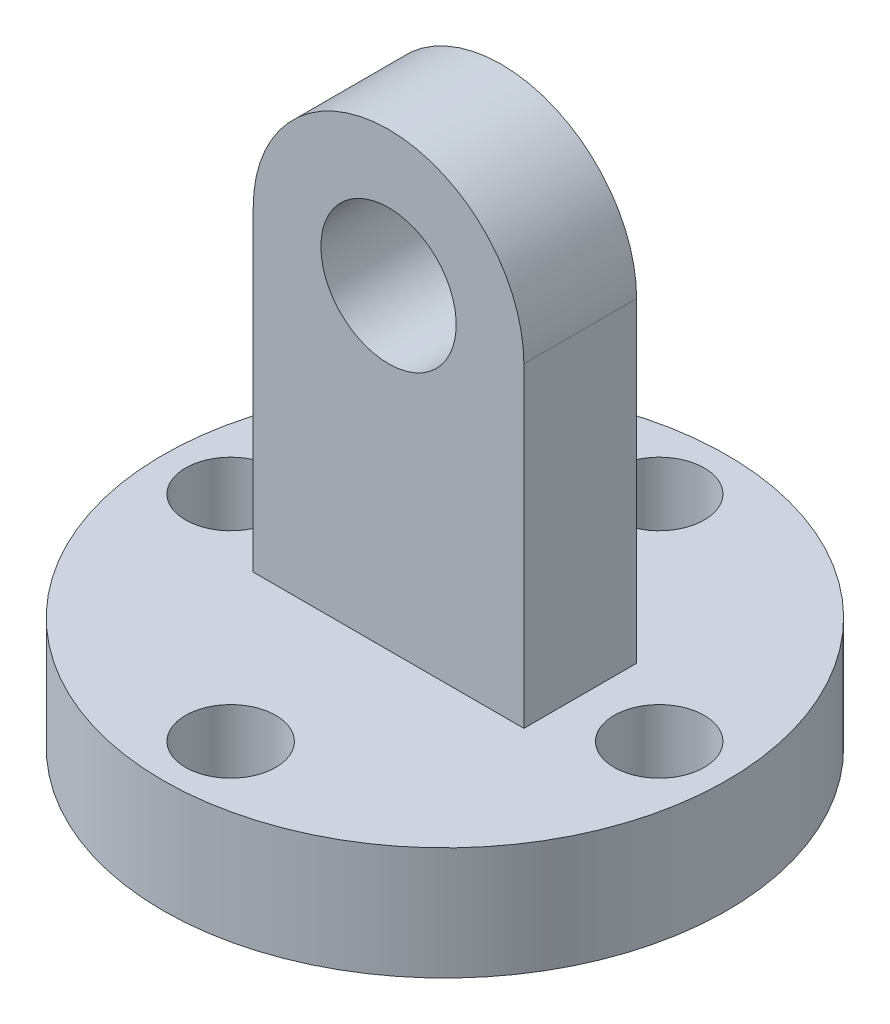
ISO-10303-21;
HEADER;
FILE_DESCRIPTION(('STEP AP214'),'2;1');
FILE_NAME('part.step','',(''),(''),'','','');
FILE_SCHEMA(('AUTOMOTIVE_DESIGN { 1 0 10303 214 1 1 1 1 }'));
ENDSEC;
DATA;
#1=APPLICATION_CONTEXT('core data for automotive mechanical design processes');
#2=APPLICATION_PROTOCOL_DEFINITION('international standard','automotive_design',2000,#1);
#3=PRODUCT_CONTEXT('',#1,'mechanical');
#4=PRODUCT('Part','Part','',(#3));
#5=PRODUCT_RELATED_PRODUCT_CATEGORY('part','',(#4));
#6=PRODUCT_DEFINITION_FORMATION('','',#4);
#7=PRODUCT_DEFINITION_CONTEXT('part definition',#1,'design');
#8=PRODUCT_DEFINITION('design','',#6,#7);
#9=PRODUCT_DEFINITION_SHAPE('','',#8);
#10=(LENGTH_UNIT() NAMED_UNIT(*) SI_UNIT(.MILLI.,.METRE.));
#11=(NAMED_UNIT(*) PLANE_ANGLE_UNIT() SI_UNIT($,.RADIAN.));
#12=(NAMED_UNIT(*) SI_UNIT($,.STERADIAN.) SOLID_ANGLE_UNIT());
#13=UNCERTAINTY_MEASURE_WITH_UNIT(LENGTH_MEASURE(1.E-05),#10,'distance_accuracy_value','');
#14=(GEOMETRIC_REPRESENTATION_CONTEXT(3) GLOBAL_UNCERTAINTY_ASSIGNED_CONTEXT((#13)) GLOBAL_UNIT_ASSIGNED_CONTEXT((#10,
#11,#12)) REPRESENTATION_CONTEXT('',''));
#15=CARTESIAN_POINT('',(0.,0.,0.));
#16=DIRECTION('',(0.,0.,1.));
#17=DIRECTION('',(1.,0.,0.));
#18=AXIS2_PLACEMENT_3D('',#15,#16,#17);
#19=CARTESIAN_POINT('',(5.99999999999999,25.,2.5));
#20=DIRECTION('',(0.,0.,-1.));
#21=DIRECTION('',(-1.,0.,0.));
#22=AXIS2_PLACEMENT_3D('',#19,#20,#21);
#23=PLANE('',#22);
#24=CARTESIAN_POINT('',(0.,19.,2.5));
#25=DIRECTION('',(0.,0.,-1.));
#26=DIRECTION('',(-1.,0.,0.));
#27=AXIS2_PLACEMENT_3D('',#24,#25,#26);
#28=CIRCLE('',#27,3.);
#29=CARTESIAN_POINT('',(-3.00000000000001,19.,2.5));
#30=VERTEX_POINT('',#29);
#31=EDGE_CURVE('E127',#30,#30,#28,.T.);
#32=ORIENTED_EDGE('',*,*,#31,.T.);
#33=EDGE_LOOP('',(#32));
#34=FACE_BOUND('',#33,.T.);
#35=DIRECTION('',(0.,-1.,0.));
#36=VECTOR('',#35,1.);
#37=CARTESIAN_POINT('',(5.99999999999999,25.,2.5));
#38=LINE('',#37,#36);
#39=CARTESIAN_POINT('',(5.99999999999948,19.,2.5));
#40=VERTEX_POINT('',#39);
#41=CARTESIAN_POINT('',(5.99999999999999,5.,2.5));
#42=VERTEX_POINT('',#41);
#43=EDGE_CURVE('E139',#40,#42,#38,.T.);
#44=ORIENTED_EDGE('',*,*,#43,.F.);
#45=CARTESIAN_POINT('',(0.,19.,2.5));
#46=DIRECTION('',(0.,0.,-1.));
#47=DIRECTION('',(-1.,0.,0.));
#48=AXIS2_PLACEMENT_3D('',#45,#46,#47);
#49=CIRCLE('',#48,6.);
#50=CARTESIAN_POINT('',(-5.99999999999985,19.,2.5));
#51=VERTEX_POINT('',#50);
#52=EDGE_CURVE('E132',#51,#40,#49,.T.);
#53=ORIENTED_EDGE('',*,*,#52,.F.);
#54=DIRECTION('',(0.,-1.,0.));
#55=VECTOR('',#54,1.);
#56=CARTESIAN_POINT('',(-6.00000000000001,25.,2.5));
#57=LINE('',#56,#55);
#58=CARTESIAN_POINT('',(-6.00000000000001,5.,2.5));
#59=VERTEX_POINT('',#58);
#60=EDGE_CURVE('E141',#51,#59,#57,.T.);
#61=ORIENTED_EDGE('',*,*,#60,.T.);
#62=DIRECTION('',(1.,0.,0.));
#63=VECTOR('',#62,1.);
#64=CARTESIAN_POINT('',(5.99999999999999,5.,2.5));
#65=LINE('',#64,#63);
#66=EDGE_CURVE('E300',#59,#42,#65,.T.);
#67=ORIENTED_EDGE('',*,*,#66,.T.);
#68=EDGE_LOOP('',(#44,#53,#61,#67));
#69=FACE_BOUND('',#68,.T.);
#70=ADVANCED_FACE('F83',(#34,#69),#23,.F.);
#71=CARTESIAN_POINT('',(5.99999999999999,25.,-2.5));
#72=DIRECTION('',(0.,0.,1.));
#73=DIRECTION('',(1.,0.,0.));
#74=AXIS2_PLACEMENT_3D('',#71,#72,#73);
#75=PLANE('',#74);
#76=CARTESIAN_POINT('',(0.,19.,-2.49999999999934));
#77=DIRECTION('',(0.,0.,-0.999999999999831));
#78=DIRECTION('',(-0.999999999999831,0.,0.));
#79=AXIS2_PLACEMENT_3D('',#76,#77,#78);
#80=CIRCLE('',#79,3.);
#81=CARTESIAN_POINT('',(-2.9999999999995,19.,-2.49999999999934));
#82=VERTEX_POINT('',#81);
#83=EDGE_CURVE('E309',#82,#82,#80,.T.);
#84=ORIENTED_EDGE('',*,*,#83,.F.);
#85=EDGE_LOOP('',(#84));
#86=FACE_BOUND('',#85,.T.);
#87=CARTESIAN_POINT('',(0.,19.,-2.49999999999992));
#88=DIRECTION('',(0.,0.,-0.99999999999998));
#89=DIRECTION('',(-0.99999999999998,0.,0.));
#90=AXIS2_PLACEMENT_3D('',#87,#88,#89);
#91=CIRCLE('',#90,6.);
#92=CARTESIAN_POINT('',(-5.99999999999985,19.,-2.49999999999992));
#93=VERTEX_POINT('',#92);
#94=CARTESIAN_POINT('',(5.99999999999948,19.,-2.49999999999974));
#95=VERTEX_POINT('',#94);
#96=EDGE_CURVE('E123',#93,#95,#91,.T.);
#97=ORIENTED_EDGE('',*,*,#96,.T.);
#98=DIRECTION('',(0.,-1.,0.));
#99=VECTOR('',#98,1.);
#100=CARTESIAN_POINT('',(5.99999999999999,25.,-2.5));
#101=LINE('',#100,#99);
#102=CARTESIAN_POINT('',(5.99999999999999,5.,-2.5));
#103=VERTEX_POINT('',#102);
#104=EDGE_CURVE('E98',#95,#103,#101,.T.);
#105=ORIENTED_EDGE('',*,*,#104,.T.);
#106=DIRECTION('',(-1.,0.,0.));
#107=VECTOR('',#106,1.);
#108=CARTESIAN_POINT('',(5.99999999999999,5.,-2.5));
#109=LINE('',#108,#107);
#110=CARTESIAN_POINT('',(-6.00000000000001,5.,-2.5));
#111=VERTEX_POINT('',#110);
#112=EDGE_CURVE('E143',#103,#111,#109,.T.);
#113=ORIENTED_EDGE('',*,*,#112,.T.);
#114=DIRECTION('',(0.,-1.,0.));
#115=VECTOR('',#114,1.);
#116=CARTESIAN_POINT('',(-6.00000000000001,25.,-2.5));
#117=LINE('',#116,#115);
#118=EDGE_CURVE('E106',#93,#111,#117,.T.);
#119=ORIENTED_EDGE('',*,*,#118,.F.);
#120=EDGE_LOOP('',(#97,#105,#113,#119));
#121=FACE_BOUND('',#120,.T.);
#122=ADVANCED_FACE('F124',(#86,#121),#75,.F.);
#123=CARTESIAN_POINT('',(5.99999999999999,25.,-2.5));
#124=DIRECTION('',(-1.,0.,0.));
#125=DIRECTION('',(0.,0.,1.));
#126=AXIS2_PLACEMENT_3D('',#123,#124,#125);
#127=PLANE('',#126);
#128=DIRECTION('',(0.,0.,-1.));
#129=VECTOR('',#128,1.);
#130=CARTESIAN_POINT('',(5.99999999999999,19.,12.5000000000002));
#131=LINE('',#130,#129);
#132=EDGE_CURVE('E13',#40,#95,#131,.T.);
#133=ORIENTED_EDGE('',*,*,#132,.F.);
#134=ORIENTED_EDGE('',*,*,#43,.T.);
#135=DIRECTION('',(0.,0.,-1.));
#136=VECTOR('',#135,1.);
#137=CARTESIAN_POINT('',(5.99999999999999,5.,-2.5));
#138=LINE('',#137,#136);
#139=EDGE_CURVE('E137',#42,#103,#138,.T.);
#140=ORIENTED_EDGE('',*,*,#139,.T.);
#141=ORIENTED_EDGE('',*,*,#104,.F.);
#142=EDGE_LOOP('',(#133,#134,#140,#141));
#143=FACE_BOUND('',#142,.T.);
#144=ADVANCED_FACE('F135',(#143),#127,.F.);
#145=CARTESIAN_POINT('',(0.,5.,0.));
#146=DIRECTION('',(0.,1.,0.));
#147=DIRECTION('',(0.,0.,1.));
#148=AXIS2_PLACEMENT_3D('',#145,#146,#147);
#149=PLANE('',#148);
#150=CARTESIAN_POINT('',(-9.5,5.,0.));
#151=DIRECTION('',(0.,1.,0.));
#152=DIRECTION('',(0.,0.,1.));
#153=AXIS2_PLACEMENT_3D('',#150,#151,#152);
#154=CIRCLE('',#153,2.);
#155=CARTESIAN_POINT('',(-9.5,5.,2.));
#156=VERTEX_POINT('',#155);
#157=EDGE_CURVE('E149',#156,#156,#154,.T.);
#158=ORIENTED_EDGE('',*,*,#157,.F.);
#159=EDGE_LOOP('',(#158));
#160=FACE_BOUND('',#159,.T.);
#161=CARTESIAN_POINT('',(0.,5.,-9.5));
#162=DIRECTION('',(0.,1.,0.));
#163=DIRECTION('',(0.,0.,1.));
#164=AXIS2_PLACEMENT_3D('',#161,#162,#163);
#165=CIRCLE('',#164,2.);
#166=CARTESIAN_POINT('',(0.,5.,-7.5));
#167=VERTEX_POINT('',#166);
#168=EDGE_CURVE('E153',#167,#167,#165,.T.);
#169=ORIENTED_EDGE('',*,*,#168,.F.);
#170=EDGE_LOOP('',(#169));
#171=FACE_BOUND('',#170,.T.);
#172=CARTESIAN_POINT('',(0.,5.,9.5));
#173=DIRECTION('',(0.,1.,0.));
#174=DIRECTION('',(0.,0.,1.));
#175=AXIS2_PLACEMENT_3D('',#172,#173,#174);
#176=CIRCLE('',#175,2.);
#177=CARTESIAN_POINT('',(0.,5.,11.5));
#178=VERTEX_POINT('',#177);
#179=EDGE_CURVE('E160',#178,#178,#176,.T.);
#180=ORIENTED_EDGE('',*,*,#179,.F.);
#181=EDGE_LOOP('',(#180));
#182=FACE_BOUND('',#181,.T.);
#183=CARTESIAN_POINT('',(9.5,5.,0.));
#184=DIRECTION('',(0.,1.,0.));
#185=DIRECTION('',(0.,0.,1.));
#186=AXIS2_PLACEMENT_3D('',#183,#184,#185);
#187=CIRCLE('',#186,2.);
#188=CARTESIAN_POINT('',(9.5,5.,2.));
#189=VERTEX_POINT('',#188);
#190=EDGE_CURVE('E166',#189,#189,#187,.T.);
#191=ORIENTED_EDGE('',*,*,#190,.F.);
#192=EDGE_LOOP('',(#191));
#193=FACE_BOUND('',#192,.T.);
#194=CARTESIAN_POINT('',(0.,5.,0.));
#195=DIRECTION('',(0.,1.,0.));
#196=DIRECTION('',(0.,0.,1.));
#197=AXIS2_PLACEMENT_3D('',#194,#195,#196);
#198=CIRCLE('',#197,12.5);
#199=CARTESIAN_POINT('',(0.,5.,12.5));
#200=VERTEX_POINT('',#199);
#201=EDGE_CURVE('E91',#200,#200,#198,.T.);
#202=ORIENTED_EDGE('',*,*,#201,.T.);
#203=EDGE_LOOP('',(#202));
#204=FACE_BOUND('',#203,.T.);
#205=ORIENTED_EDGE('',*,*,#66,.F.);
#206=DIRECTION('',(0.,0.,1.));
#207=VECTOR('',#206,1.);
#208=CARTESIAN_POINT('',(-6.00000000000001,5.,-2.5));
#209=LINE('',#208,#207);
#210=EDGE_CURVE('E301',#111,#59,#209,.T.);
#211=ORIENTED_EDGE('',*,*,#210,.F.);
#212=ORIENTED_EDGE('',*,*,#112,.F.);
#213=ORIENTED_EDGE('',*,*,#139,.F.);
#214=EDGE_LOOP('',(#205,#211,#212,#213));
#215=FACE_BOUND('',#214,.T.);
#216=ADVANCED_FACE('F206',(#160,#171,#182,#193,#204,#215),#149,.T.);
#217=CARTESIAN_POINT('',(0.,0.,9.5));
#218=DIRECTION('',(0.,1.,0.));
#219=DIRECTION('',(0.,0.,1.));
#220=AXIS2_PLACEMENT_3D('',#217,#218,#219);
#221=CYLINDRICAL_SURFACE('',#220,1.1);
#222=CARTESIAN_POINT('',(0.,0.,9.5));
#223=DIRECTION('',(0.,1.,0.));
#224=DIRECTION('',(0.,0.,1.));
#225=AXIS2_PLACEMENT_3D('',#222,#223,#224);
#226=CIRCLE('',#225,1.1);
#227=CARTESIAN_POINT('',(0.,0.,10.6));
#228=VERTEX_POINT('',#227);
#229=EDGE_CURVE('E183',#228,#228,#226,.T.);
#230=ORIENTED_EDGE('',*,*,#229,.F.);
#231=EDGE_LOOP('',(#230));
#232=FACE_BOUND('',#231,.T.);
#233=CARTESIAN_POINT('',(0.,2.,9.5));
#234=DIRECTION('',(0.,1.,0.));
#235=DIRECTION('',(0.,0.,1.));
#236=AXIS2_PLACEMENT_3D('',#233,#234,#235);
#237=CIRCLE('',#236,1.1);
#238=CARTESIAN_POINT('',(0.,2.,10.6));
#239=VERTEX_POINT('',#238);
#240=EDGE_CURVE('E186',#239,#239,#237,.F.);
#241=ORIENTED_EDGE('',*,*,#240,.F.);
#242=EDGE_LOOP('',(#241));
#243=FACE_BOUND('',#242,.T.);
#244=ADVANCED_FACE('F203',(#232,#243),#221,.F.);
#245=CARTESIAN_POINT('',(9.5,0.,0.));
#246=DIRECTION('',(0.,1.,0.));
#247=DIRECTION('',(0.,0.,1.));
#248=AXIS2_PLACEMENT_3D('',#245,#246,#247);
#249=CYLINDRICAL_SURFACE('',#248,1.1);
#250=CARTESIAN_POINT('',(9.5,0.,0.));
#251=DIRECTION('',(0.,1.,0.));
#252=DIRECTION('',(0.,0.,1.));
#253=AXIS2_PLACEMENT_3D('',#250,#251,#252);
#254=CIRCLE('',#253,1.1);
#255=CARTESIAN_POINT('',(9.5,0.,1.1));
#256=VERTEX_POINT('',#255);
#257=EDGE_CURVE('E180',#256,#256,#254,.T.);
#258=ORIENTED_EDGE('',*,*,#257,.F.);
#259=EDGE_LOOP('',(#258));
#260=FACE_BOUND('',#259,.T.);
#261=CARTESIAN_POINT('',(9.5,2.,0.));
#262=DIRECTION('',(0.,1.,0.));
#263=DIRECTION('',(0.,0.,1.));
#264=AXIS2_PLACEMENT_3D('',#261,#262,#263);
#265=CIRCLE('',#264,1.1);
#266=CARTESIAN_POINT('',(9.5,2.,1.1));
#267=VERTEX_POINT('',#266);
#268=EDGE_CURVE('E196',#267,#267,#265,.F.);
#269=ORIENTED_EDGE('',*,*,#268,.F.);
#270=EDGE_LOOP('',(#269));
#271=FACE_BOUND('',#270,.T.);
#272=ADVANCED_FACE('F205',(#260,#271),#249,.F.);
#273=CARTESIAN_POINT('',(0.,0.,-9.5));
#274=DIRECTION('',(0.,1.,0.));
#275=DIRECTION('',(0.,0.,1.));
#276=AXIS2_PLACEMENT_3D('',#273,#274,#275);
#277=CYLINDRICAL_SURFACE('',#276,1.1);
#278=CARTESIAN_POINT('',(0.,0.,-9.5));
#279=DIRECTION('',(0.,1.,0.));
#280=DIRECTION('',(0.,0.,1.));
#281=AXIS2_PLACEMENT_3D('',#278,#279,#280);
#282=CIRCLE('',#281,1.1);
#283=CARTESIAN_POINT('',(0.,0.,-8.4));
#284=VERTEX_POINT('',#283);
#285=EDGE_CURVE('E177',#284,#284,#282,.T.);
#286=ORIENTED_EDGE('',*,*,#285,.F.);
#287=EDGE_LOOP('',(#286));
#288=FACE_BOUND('',#287,.T.);
#289=CARTESIAN_POINT('',(0.,2.,-9.5));
#290=DIRECTION('',(0.,1.,0.));
#291=DIRECTION('',(0.,0.,1.));
#292=AXIS2_PLACEMENT_3D('',#289,#290,#291);
#293=CIRCLE('',#292,1.1);
#294=CARTESIAN_POINT('',(0.,2.,-8.4));
#295=VERTEX_POINT('',#294);
#296=EDGE_CURVE('E193',#295,#295,#293,.F.);
#297=ORIENTED_EDGE('',*,*,#296,.F.);
#298=EDGE_LOOP('',(#297));
#299=FACE_BOUND('',#298,.T.);
#300=ADVANCED_FACE('F213',(#288,#299),#277,.F.);
#301=CARTESIAN_POINT('',(-9.5,0.,0.));
#302=DIRECTION('',(0.,1.,0.));
#303=DIRECTION('',(0.,0.,1.));
#304=AXIS2_PLACEMENT_3D('',#301,#302,#303);
#305=CYLINDRICAL_SURFACE('',#304,1.1);
#306=CARTESIAN_POINT('',(-9.5,0.,0.));
#307=DIRECTION('',(0.,1.,0.));
#308=DIRECTION('',(0.,0.,1.));
#309=AXIS2_PLACEMENT_3D('',#306,#307,#308);
#310=CIRCLE('',#309,1.1);
#311=CARTESIAN_POINT('',(-9.5,0.,1.1));
#312=VERTEX_POINT('',#311);
#313=EDGE_CURVE('E173',#312,#312,#310,.T.);
#314=ORIENTED_EDGE('',*,*,#313,.F.);
#315=EDGE_LOOP('',(#314));
#316=FACE_BOUND('',#315,.T.);
#317=CARTESIAN_POINT('',(-9.5,2.,0.));
#318=DIRECTION('',(0.,1.,0.));
#319=DIRECTION('',(0.,0.,1.));
#320=AXIS2_PLACEMENT_3D('',#317,#318,#319);
#321=CIRCLE('',#320,1.1);
#322=CARTESIAN_POINT('',(-9.5,2.,1.1));
#323=VERTEX_POINT('',#322);
#324=EDGE_CURVE('E156',#323,#323,#321,.F.);
#325=ORIENTED_EDGE('',*,*,#324,.F.);
#326=EDGE_LOOP('',(#325));
#327=FACE_BOUND('',#326,.T.);
#328=ADVANCED_FACE('F268',(#316,#327),#305,.F.);
#329=CARTESIAN_POINT('',(0.,5.,0.));
#330=DIRECTION('',(0.,-1.,0.));
#331=DIRECTION('',(0.,0.,-1.));
#332=AXIS2_PLACEMENT_3D('',#329,#330,#331);
#333=CYLINDRICAL_SURFACE('',#332,12.5);
#334=ORIENTED_EDGE('',*,*,#201,.F.);
#335=EDGE_LOOP('',(#334));
#336=FACE_BOUND('',#335,.T.);
#337=CARTESIAN_POINT('',(0.,0.,0.));
#338=DIRECTION('',(0.,1.,0.));
#339=DIRECTION('',(0.,0.,1.));
#340=AXIS2_PLACEMENT_3D('',#337,#338,#339);
#341=CIRCLE('',#340,12.5);
#342=CARTESIAN_POINT('',(0.,0.,12.5));
#343=VERTEX_POINT('',#342);
#344=EDGE_CURVE('E176',#343,#343,#341,.T.);
#345=ORIENTED_EDGE('',*,*,#344,.T.);
#346=EDGE_LOOP('',(#345));
#347=FACE_BOUND('',#346,.T.);
#348=ADVANCED_FACE('F85',(#336,#347),#333,.T.);
#349=CARTESIAN_POINT('',(0.,0.,0.));
#350=DIRECTION('',(0.,1.,0.));
#351=DIRECTION('',(0.,0.,1.));
#352=AXIS2_PLACEMENT_3D('',#349,#350,#351);
#353=PLANE('',#352);
#354=ORIENTED_EDGE('',*,*,#313,.T.);
#355=EDGE_LOOP('',(#354));
#356=FACE_BOUND('',#355,.T.);
#357=ORIENTED_EDGE('',*,*,#285,.T.);
#358=EDGE_LOOP('',(#357));
#359=FACE_BOUND('',#358,.T.);
#360=ORIENTED_EDGE('',*,*,#257,.T.);
#361=EDGE_LOOP('',(#360));
#362=FACE_BOUND('',#361,.T.);
#363=ORIENTED_EDGE('',*,*,#229,.T.);
#364=EDGE_LOOP('',(#363));
#365=FACE_BOUND('',#364,.T.);
#366=ORIENTED_EDGE('',*,*,#344,.F.);
#367=EDGE_LOOP('',(#366));
#368=FACE_BOUND('',#367,.T.);
#369=ADVANCED_FACE('F241',(#356,#359,#362,#365,#368),#353,.F.);
#370=CARTESIAN_POINT('',(0.,2.,0.));
#371=DIRECTION('',(0.,1.,0.));
#372=DIRECTION('',(0.,0.,1.));
#373=AXIS2_PLACEMENT_3D('',#370,#371,#372);
#374=PLANE('',#373);
#375=CARTESIAN_POINT('',(-9.5,2.,0.));
#376=DIRECTION('',(0.,1.,0.));
#377=DIRECTION('',(0.,0.,1.));
#378=AXIS2_PLACEMENT_3D('',#375,#376,#377);
#379=CIRCLE('',#378,2.);
#380=CARTESIAN_POINT('',(-9.5,2.,2.));
#381=VERTEX_POINT('',#380);
#382=EDGE_CURVE('E152',#381,#381,#379,.F.);
#383=ORIENTED_EDGE('',*,*,#382,.F.);
#384=EDGE_LOOP('',(#383));
#385=FACE_BOUND('',#384,.T.);
#386=ORIENTED_EDGE('',*,*,#324,.T.);
#387=EDGE_LOOP('',(#386));
#388=FACE_BOUND('',#387,.T.);
#389=ADVANCED_FACE('F237',(#385,#388),#374,.T.);
#390=CARTESIAN_POINT('',(-9.5,-5.65685424949238,0.));
#391=DIRECTION('',(0.,1.,0.));
#392=DIRECTION('',(0.,0.,1.));
#393=AXIS2_PLACEMENT_3D('',#390,#391,#392);
#394=CYLINDRICAL_SURFACE('',#393,2.);
#395=ORIENTED_EDGE('',*,*,#382,.T.);
#396=EDGE_LOOP('',(#395));
#397=FACE_BOUND('',#396,.T.);
#398=ORIENTED_EDGE('',*,*,#157,.T.);
#399=EDGE_LOOP('',(#398));
#400=FACE_BOUND('',#399,.T.);
#401=ADVANCED_FACE('F240',(#397,#400),#394,.F.);
#402=CARTESIAN_POINT('',(0.,2.,0.));
#403=DIRECTION('',(0.,1.,0.));
#404=DIRECTION('',(0.,0.,1.));
#405=AXIS2_PLACEMENT_3D('',#402,#403,#404);
#406=PLANE('',#405);
#407=CARTESIAN_POINT('',(0.,2.,-9.5));
#408=DIRECTION('',(0.,1.,0.));
#409=DIRECTION('',(0.,0.,1.));
#410=AXIS2_PLACEMENT_3D('',#407,#408,#409);
#411=CIRCLE('',#410,2.);
#412=CARTESIAN_POINT('',(0.,2.,-7.5));
#413=VERTEX_POINT('',#412);
#414=EDGE_CURVE('E157',#413,#413,#411,.F.);
#415=ORIENTED_EDGE('',*,*,#414,.F.);
#416=EDGE_LOOP('',(#415));
#417=FACE_BOUND('',#416,.T.);
#418=ORIENTED_EDGE('',*,*,#296,.T.);
#419=EDGE_LOOP('',(#418));
#420=FACE_BOUND('',#419,.T.);
#421=ADVANCED_FACE('F245',(#417,#420),#406,.T.);
#422=CARTESIAN_POINT('',(0.,-5.65685424949238,-9.5));
#423=DIRECTION('',(0.,1.,0.));
#424=DIRECTION('',(0.,0.,1.));
#425=AXIS2_PLACEMENT_3D('',#422,#423,#424);
#426=CYLINDRICAL_SURFACE('',#425,2.);
#427=ORIENTED_EDGE('',*,*,#414,.T.);
#428=EDGE_LOOP('',(#427));
#429=FACE_BOUND('',#428,.T.);
#430=ORIENTED_EDGE('',*,*,#168,.T.);
#431=EDGE_LOOP('',(#430));
#432=FACE_BOUND('',#431,.T.);
#433=ADVANCED_FACE('F247',(#429,#432),#426,.F.);
#434=CARTESIAN_POINT('',(0.,2.,0.));
#435=DIRECTION('',(0.,1.,0.));
#436=DIRECTION('',(0.,0.,1.));
#437=AXIS2_PLACEMENT_3D('',#434,#435,#436);
#438=PLANE('',#437);
#439=CARTESIAN_POINT('',(9.5,2.,0.));
#440=DIRECTION('',(0.,1.,0.));
#441=DIRECTION('',(0.,0.,1.));
#442=AXIS2_PLACEMENT_3D('',#439,#440,#441);
#443=CIRCLE('',#442,2.);
#444=CARTESIAN_POINT('',(9.5,2.,2.));
#445=VERTEX_POINT('',#444);
#446=EDGE_CURVE('E148',#445,#445,#443,.F.);
#447=ORIENTED_EDGE('',*,*,#446,.F.);
#448=EDGE_LOOP('',(#447));
#449=FACE_BOUND('',#448,.T.);
#450=ORIENTED_EDGE('',*,*,#268,.T.);
#451=EDGE_LOOP('',(#450));
#452=FACE_BOUND('',#451,.T.);
#453=ADVANCED_FACE('F250',(#449,#452),#438,.T.);
#454=CARTESIAN_POINT('',(9.5,-5.65685424949238,0.));
#455=DIRECTION('',(0.,1.,0.));
#456=DIRECTION('',(0.,0.,1.));
#457=AXIS2_PLACEMENT_3D('',#454,#455,#456);
#458=CYLINDRICAL_SURFACE('',#457,2.);
#459=ORIENTED_EDGE('',*,*,#446,.T.);
#460=EDGE_LOOP('',(#459));
#461=FACE_BOUND('',#460,.T.);
#462=ORIENTED_EDGE('',*,*,#190,.T.);
#463=EDGE_LOOP('',(#462));
#464=FACE_BOUND('',#463,.T.);
#465=ADVANCED_FACE('F260',(#461,#464),#458,.F.);
#466=CARTESIAN_POINT('',(0.,2.,0.));
#467=DIRECTION('',(0.,1.,0.));
#468=DIRECTION('',(0.,0.,1.));
#469=AXIS2_PLACEMENT_3D('',#466,#467,#468);
#470=PLANE('',#469);
#471=CARTESIAN_POINT('',(0.,2.,9.5));
#472=DIRECTION('',(0.,1.,0.));
#473=DIRECTION('',(0.,0.,1.));
#474=AXIS2_PLACEMENT_3D('',#471,#472,#473);
#475=CIRCLE('',#474,2.);
#476=CARTESIAN_POINT('',(0.,2.,11.5));
#477=VERTEX_POINT('',#476);
#478=EDGE_CURVE('E163',#477,#477,#475,.F.);
#479=ORIENTED_EDGE('',*,*,#478,.F.);
#480=EDGE_LOOP('',(#479));
#481=FACE_BOUND('',#480,.T.);
#482=ORIENTED_EDGE('',*,*,#240,.T.);
#483=EDGE_LOOP('',(#482));
#484=FACE_BOUND('',#483,.T.);
#485=ADVANCED_FACE('F201',(#481,#484),#470,.T.);
#486=CARTESIAN_POINT('',(0.,-5.65685424949238,9.5));
#487=DIRECTION('',(0.,1.,0.));
#488=DIRECTION('',(0.,0.,1.));
#489=AXIS2_PLACEMENT_3D('',#486,#487,#488);
#490=CYLINDRICAL_SURFACE('',#489,2.);
#491=ORIENTED_EDGE('',*,*,#478,.T.);
#492=EDGE_LOOP('',(#491));
#493=FACE_BOUND('',#492,.T.);
#494=ORIENTED_EDGE('',*,*,#179,.T.);
#495=EDGE_LOOP('',(#494));
#496=FACE_BOUND('',#495,.T.);
#497=ADVANCED_FACE('F236',(#493,#496),#490,.F.);
#498=CARTESIAN_POINT('',(-6.00000000000001,25.,-2.5));
#499=DIRECTION('',(1.,0.,0.));
#500=DIRECTION('',(0.,0.,-1.));
#501=AXIS2_PLACEMENT_3D('',#498,#499,#500);
#502=PLANE('',#501);
#503=ORIENTED_EDGE('',*,*,#60,.F.);
#504=DIRECTION('',(0.,0.,-1.));
#505=VECTOR('',#504,1.);
#506=CARTESIAN_POINT('',(-5.99999999999985,19.,12.5));
#507=LINE('',#506,#505);
#508=EDGE_CURVE('E126',#51,#93,#507,.T.);
#509=ORIENTED_EDGE('',*,*,#508,.T.);
#510=ORIENTED_EDGE('',*,*,#118,.T.);
#511=ORIENTED_EDGE('',*,*,#210,.T.);
#512=EDGE_LOOP('',(#503,#509,#510,#511));
#513=FACE_BOUND('',#512,.T.);
#514=ADVANCED_FACE('F233',(#513),#502,.F.);
#515=CARTESIAN_POINT('',(0.,19.,12.5));
#516=DIRECTION('',(0.,0.,-1.));
#517=DIRECTION('',(-1.,0.,0.));
#518=AXIS2_PLACEMENT_3D('',#515,#516,#517);
#519=CYLINDRICAL_SURFACE('',#518,6.);
#520=ORIENTED_EDGE('',*,*,#52,.T.);
#521=ORIENTED_EDGE('',*,*,#132,.T.);
#522=ORIENTED_EDGE('',*,*,#96,.F.);
#523=ORIENTED_EDGE('',*,*,#508,.F.);
#524=EDGE_LOOP('',(#520,#521,#522,#523));
#525=FACE_BOUND('',#524,.T.);
#526=ADVANCED_FACE('F130',(#525),#519,.T.);
#527=CARTESIAN_POINT('',(0.,19.,12.5000000000006));
#528=DIRECTION('',(0.,0.,-1.));
#529=DIRECTION('',(-1.,0.,0.));
#530=AXIS2_PLACEMENT_3D('',#527,#528,#529);
#531=CYLINDRICAL_SURFACE('',#530,3.);
#532=ORIENTED_EDGE('',*,*,#83,.T.);
#533=EDGE_LOOP('',(#532));
#534=FACE_BOUND('',#533,.T.);
#535=ORIENTED_EDGE('',*,*,#31,.F.);
#536=EDGE_LOOP('',(#535));
#537=FACE_BOUND('',#536,.T.);
#538=ADVANCED_FACE('F313',(#534,#537),#531,.F.);
#539=CLOSED_SHELL('',(#70,#122,#144,#216,#244,#272,#300,#328,#348,#369,#389,#401,#421,#433,#453,
#465,#485,#497,#514,#526,#538));
#540=MANIFOLD_SOLID_BREP('B2',#539);
#541=ADVANCED_BREP_SHAPE_REPRESENTATION('',(#18,#540),#14);
#542=SHAPE_DEFINITION_REPRESENTATION(#9,#541);
ENDSEC;
END-ISO-10303-21;
